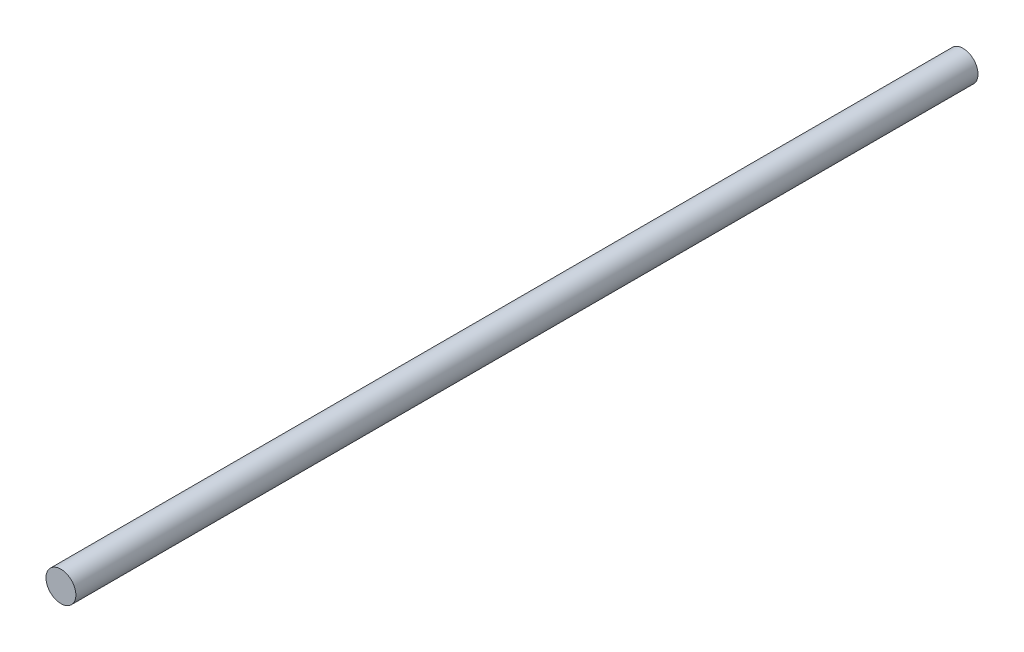
ISO-10303-21;
HEADER;
FILE_DESCRIPTION(('STEP AP214'),'2;1');
FILE_NAME('part.step','',(''),(''),'','','');
FILE_SCHEMA(('AUTOMOTIVE_DESIGN { 1 0 10303 214 1 1 1 1 }'));
ENDSEC;
DATA;
#1=APPLICATION_CONTEXT('core data for automotive mechanical design processes');
#2=APPLICATION_PROTOCOL_DEFINITION('international standard','automotive_design',2000,#1);
#3=PRODUCT_CONTEXT('',#1,'mechanical');
#4=PRODUCT('Part','Part','',(#3));
#5=PRODUCT_RELATED_PRODUCT_CATEGORY('part','',(#4));
#6=PRODUCT_DEFINITION_FORMATION('','',#4);
#7=PRODUCT_DEFINITION_CONTEXT('part definition',#1,'design');
#8=PRODUCT_DEFINITION('design','',#6,#7);
#9=PRODUCT_DEFINITION_SHAPE('','',#8);
#10=(LENGTH_UNIT() NAMED_UNIT(*) SI_UNIT(.MILLI.,.METRE.));
#11=(NAMED_UNIT(*) PLANE_ANGLE_UNIT() SI_UNIT($,.RADIAN.));
#12=(NAMED_UNIT(*) SI_UNIT($,.STERADIAN.) SOLID_ANGLE_UNIT());
#13=UNCERTAINTY_MEASURE_WITH_UNIT(LENGTH_MEASURE(1.E-05),#10,'distance_accuracy_value','');
#14=(GEOMETRIC_REPRESENTATION_CONTEXT(3) GLOBAL_UNCERTAINTY_ASSIGNED_CONTEXT((#13)) GLOBAL_UNIT_ASSIGNED_CONTEXT((#10,
#11,#12)) REPRESENTATION_CONTEXT('',''));
#15=CARTESIAN_POINT('',(0.,0.,0.));
#16=DIRECTION('',(0.,0.,1.));
#17=DIRECTION('',(1.,0.,0.));
#18=AXIS2_PLACEMENT_3D('',#15,#16,#17);
#19=CARTESIAN_POINT('',(0.,0.,120.701750194436));
#20=DIRECTION('',(0.,0.,-1.));
#21=DIRECTION('',(-1.,0.,0.));
#22=AXIS2_PLACEMENT_3D('',#19,#20,#21);
#23=CYLINDRICAL_SURFACE('',#22,2.);
#24=CARTESIAN_POINT('',(0.,0.,120.701750194436));
#25=DIRECTION('',(0.,0.,1.));
#26=DIRECTION('',(1.,0.,0.));
#27=AXIS2_PLACEMENT_3D('',#24,#25,#26);
#28=CIRCLE('',#27,2.);
#29=CARTESIAN_POINT('',(2.,0.,120.701750194436));
#30=VERTEX_POINT('',#29);
#31=EDGE_CURVE('E10',#30,#30,#28,.T.);
#32=ORIENTED_EDGE('',*,*,#31,.F.);
#33=EDGE_LOOP('',(#32));
#34=FACE_BOUND('',#33,.T.);
#35=CARTESIAN_POINT('',(0.,0.,0.));
#36=DIRECTION('',(0.,0.,1.));
#37=DIRECTION('',(1.,0.,0.));
#38=AXIS2_PLACEMENT_3D('',#35,#36,#37);
#39=CIRCLE('',#38,2.);
#40=CARTESIAN_POINT('',(2.,0.,0.));
#41=VERTEX_POINT('',#40);
#42=EDGE_CURVE('E40',#41,#41,#39,.T.);
#43=ORIENTED_EDGE('',*,*,#42,.T.);
#44=EDGE_LOOP('',(#43));
#45=FACE_BOUND('',#44,.T.);
#46=ADVANCED_FACE('F37',(#34,#45),#23,.T.);
#47=CARTESIAN_POINT('',(0.,0.,120.701750194436));
#48=DIRECTION('',(0.,0.,1.));
#49=DIRECTION('',(1.,0.,0.));
#50=AXIS2_PLACEMENT_3D('',#47,#48,#49);
#51=PLANE('',#50);
#52=ORIENTED_EDGE('',*,*,#31,.T.);
#53=EDGE_LOOP('',(#52));
#54=FACE_BOUND('',#53,.T.);
#55=ADVANCED_FACE('F52',(#54),#51,.T.);
#56=CARTESIAN_POINT('',(0.,0.,0.));
#57=DIRECTION('',(0.,0.,1.));
#58=DIRECTION('',(1.,0.,0.));
#59=AXIS2_PLACEMENT_3D('',#56,#57,#58);
#60=PLANE('',#59);
#61=ORIENTED_EDGE('',*,*,#42,.F.);
#62=EDGE_LOOP('',(#61));
#63=FACE_BOUND('',#62,.T.);
#64=ADVANCED_FACE('F50',(#63),#60,.F.);
#65=CLOSED_SHELL('',(#46,#55,#64));
#66=MANIFOLD_SOLID_BREP('B2',#65);
#67=ADVANCED_BREP_SHAPE_REPRESENTATION('',(#18,#66),#14);
#68=SHAPE_DEFINITION_REPRESENTATION(#9,#67);
ENDSEC;
END-ISO-10303-21;
